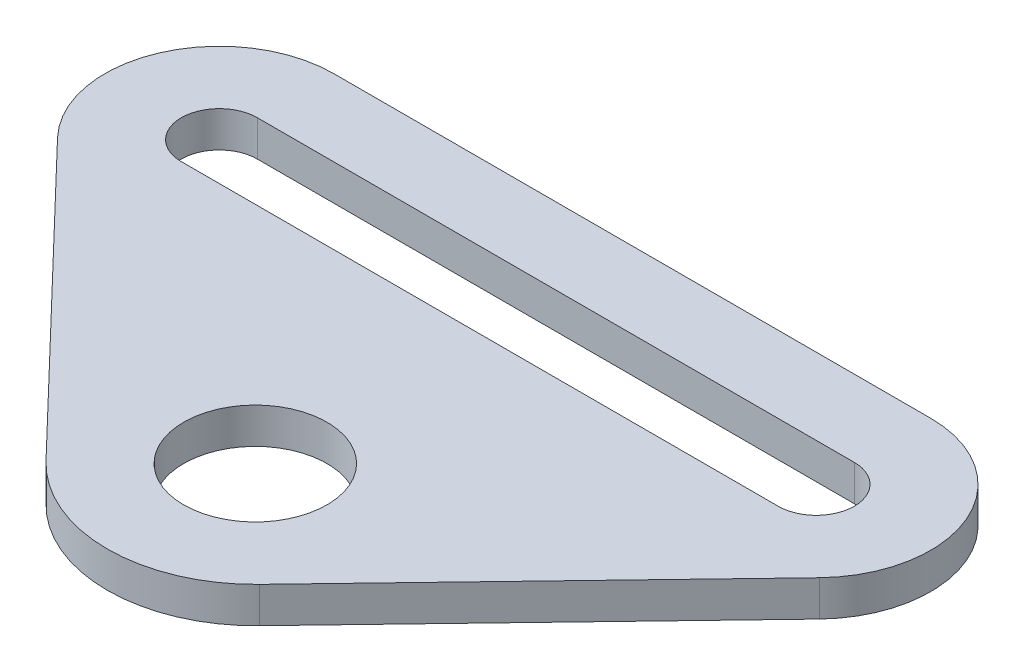
ISO-10303-21;
HEADER;
FILE_DESCRIPTION(('STEP AP214'),'2;1');
FILE_NAME('part.step','',(''),(''),'','','');
FILE_SCHEMA(('AUTOMOTIVE_DESIGN { 1 0 10303 214 1 1 1 1 }'));
ENDSEC;
DATA;
#1=APPLICATION_CONTEXT('core data for automotive mechanical design processes');
#2=APPLICATION_PROTOCOL_DEFINITION('international standard','automotive_design',2000,#1);
#3=PRODUCT_CONTEXT('',#1,'mechanical');
#4=PRODUCT('Part','Part','',(#3));
#5=PRODUCT_RELATED_PRODUCT_CATEGORY('part','',(#4));
#6=PRODUCT_DEFINITION_FORMATION('','',#4);
#7=PRODUCT_DEFINITION_CONTEXT('part definition',#1,'design');
#8=PRODUCT_DEFINITION('design','',#6,#7);
#9=PRODUCT_DEFINITION_SHAPE('','',#8);
#10=(LENGTH_UNIT() NAMED_UNIT(*) SI_UNIT(.MILLI.,.METRE.));
#11=(NAMED_UNIT(*) PLANE_ANGLE_UNIT() SI_UNIT($,.RADIAN.));
#12=(NAMED_UNIT(*) SI_UNIT($,.STERADIAN.) SOLID_ANGLE_UNIT());
#13=UNCERTAINTY_MEASURE_WITH_UNIT(LENGTH_MEASURE(1.E-05),#10,'distance_accuracy_value','');
#14=(GEOMETRIC_REPRESENTATION_CONTEXT(3) GLOBAL_UNCERTAINTY_ASSIGNED_CONTEXT((#13)) GLOBAL_UNIT_ASSIGNED_CONTEXT((#10,
#11,#12)) REPRESENTATION_CONTEXT('',''));
#15=CARTESIAN_POINT('',(0.,0.,0.));
#16=DIRECTION('',(0.,0.,1.));
#17=DIRECTION('',(1.,0.,0.));
#18=AXIS2_PLACEMENT_3D('',#15,#16,#17);
#19=CARTESIAN_POINT('',(25.,3.,-21.9844553636769));
#20=DIRECTION('',(0.,1.,0.));
#21=DIRECTION('',(0.,0.,1.));
#22=AXIS2_PLACEMENT_3D('',#19,#20,#21);
#23=PLANE('',#22);
#24=DIRECTION('',(1.,0.,0.));
#25=VECTOR('',#24,1.);
#26=CARTESIAN_POINT('',(-25.,3.,-18.8));
#27=LINE('',#26,#25);
#28=CARTESIAN_POINT('',(-25.,3.,-18.8));
#29=VERTEX_POINT('',#28);
#30=CARTESIAN_POINT('',(25.,3.,-18.8));
#31=VERTEX_POINT('',#30);
#32=EDGE_CURVE('E132',#29,#31,#27,.T.);
#33=ORIENTED_EDGE('',*,*,#32,.F.);
#34=CARTESIAN_POINT('',(-25.,3.,-21.9844553636769));
#35=DIRECTION('',(0.,1.,0.));
#36=DIRECTION('',(0.,0.,1.));
#37=AXIS2_PLACEMENT_3D('',#34,#35,#36);
#38=CIRCLE('',#37,3.1844553636769);
#39=CARTESIAN_POINT('',(-25.,3.,-25.1689107273538));
#40=VERTEX_POINT('',#39);
#41=EDGE_CURVE('E123',#40,#29,#38,.T.);
#42=ORIENTED_EDGE('',*,*,#41,.F.);
#43=DIRECTION('',(-1.,0.,0.));
#44=VECTOR('',#43,1.);
#45=CARTESIAN_POINT('',(-25.,3.,-25.1689107273538));
#46=LINE('',#45,#44);
#47=CARTESIAN_POINT('',(25.,3.,-25.1689107273538));
#48=VERTEX_POINT('',#47);
#49=EDGE_CURVE('E150',#48,#40,#46,.T.);
#50=ORIENTED_EDGE('',*,*,#49,.F.);
#51=CARTESIAN_POINT('',(25.,3.,-21.9844553636769));
#52=DIRECTION('',(0.,1.,0.));
#53=DIRECTION('',(0.,0.,1.));
#54=AXIS2_PLACEMENT_3D('',#51,#52,#53);
#55=CIRCLE('',#54,3.1844553636769);
#56=EDGE_CURVE('E146',#31,#48,#55,.T.);
#57=ORIENTED_EDGE('',*,*,#56,.F.);
#58=EDGE_LOOP('',(#33,#42,#50,#57));
#59=FACE_BOUND('',#58,.T.);
#60=CARTESIAN_POINT('',(25.,3.,-21.9844553636769));
#61=DIRECTION('',(0.,1.,0.));
#62=DIRECTION('',(0.,0.,1.));
#63=AXIS2_PLACEMENT_3D('',#60,#61,#62);
#64=CIRCLE('',#63,9.58445536367691);
#65=CARTESIAN_POINT('',(31.9152643441121,3.,-15.3481232691109));
#66=VERTEX_POINT('',#65);
#67=CARTESIAN_POINT('',(25.,3.,-31.5689107273538));
#68=VERTEX_POINT('',#67);
#69=EDGE_CURVE('E174',#66,#68,#64,.T.);
#70=ORIENTED_EDGE('',*,*,#69,.T.);
#71=DIRECTION('',(-1.,0.,0.));
#72=VECTOR('',#71,1.);
#73=CARTESIAN_POINT('',(25.,3.,-31.5689107273538));
#74=LINE('',#73,#72);
#75=CARTESIAN_POINT('',(-25.,3.,-31.5689107273538));
#76=VERTEX_POINT('',#75);
#77=EDGE_CURVE('E178',#68,#76,#74,.T.);
#78=ORIENTED_EDGE('',*,*,#77,.T.);
#79=CARTESIAN_POINT('',(-25.,3.,-21.9844553636769));
#80=DIRECTION('',(0.,1.,0.));
#81=DIRECTION('',(0.,0.,1.));
#82=AXIS2_PLACEMENT_3D('',#79,#80,#81);
#83=CIRCLE('',#82,9.58445536367691);
#84=CARTESIAN_POINT('',(-31.9152643441121,3.,-15.3481232691109));
#85=VERTEX_POINT('',#84);
#86=EDGE_CURVE('E182',#76,#85,#83,.T.);
#87=ORIENTED_EDGE('',*,*,#86,.T.);
#88=DIRECTION('',(0.692405759404582,0.,0.721508325900238));
#89=VECTOR('',#88,1.);
#90=CARTESIAN_POINT('',(-8.94670324116295,3.,8.58583141661682));
#91=LINE('',#90,#89);
#92=CARTESIAN_POINT('',(-8.94670324116295,3.,8.58583141661682));
#93=VERTEX_POINT('',#92);
#94=EDGE_CURVE('E185',#85,#93,#91,.T.);
#95=ORIENTED_EDGE('',*,*,#94,.T.);
#96=CARTESIAN_POINT('',(0.,3.,0.));
#97=DIRECTION('',(0.,1.,0.));
#98=DIRECTION('',(0.,0.,1.));
#99=AXIS2_PLACEMENT_3D('',#96,#97,#98);
#100=CIRCLE('',#99,12.4);
#101=CARTESIAN_POINT('',(8.94670324116294,3.,8.58583141661682));
#102=VERTEX_POINT('',#101);
#103=EDGE_CURVE('E188',#93,#102,#100,.T.);
#104=ORIENTED_EDGE('',*,*,#103,.T.);
#105=DIRECTION('',(0.692405759404582,0.,-0.721508325900238));
#106=VECTOR('',#105,1.);
#107=CARTESIAN_POINT('',(8.94670324116295,3.,8.58583141661682));
#108=LINE('',#107,#106);
#109=EDGE_CURVE('E191',#102,#66,#108,.T.);
#110=ORIENTED_EDGE('',*,*,#109,.T.);
#111=EDGE_LOOP('',(#70,#78,#87,#95,#104,#110));
#112=FACE_BOUND('',#111,.T.);
#113=CARTESIAN_POINT('',(0.,3.,0.));
#114=DIRECTION('',(0.,1.,0.));
#115=DIRECTION('',(0.,0.,1.));
#116=AXIS2_PLACEMENT_3D('',#113,#114,#115);
#117=CIRCLE('',#116,6.);
#118=CARTESIAN_POINT('',(0.,3.,6.));
#119=VERTEX_POINT('',#118);
#120=EDGE_CURVE('E158',#119,#119,#117,.T.);
#121=ORIENTED_EDGE('',*,*,#120,.F.);
#122=EDGE_LOOP('',(#121));
#123=FACE_BOUND('',#122,.T.);
#124=ADVANCED_FACE('F45',(#59,#112,#123),#23,.T.);
#125=CARTESIAN_POINT('',(25.,0.,-21.9844553636769));
#126=DIRECTION('',(0.,1.,0.));
#127=DIRECTION('',(0.,0.,1.));
#128=AXIS2_PLACEMENT_3D('',#125,#126,#127);
#129=PLANE('',#128);
#130=CARTESIAN_POINT('',(25.,0.,-21.9844553636769));
#131=DIRECTION('',(0.,1.,0.));
#132=DIRECTION('',(0.,0.,1.));
#133=AXIS2_PLACEMENT_3D('',#130,#131,#132);
#134=CIRCLE('',#133,9.58445536367691);
#135=CARTESIAN_POINT('',(31.9152643441121,0.,-15.3481232691109));
#136=VERTEX_POINT('',#135);
#137=CARTESIAN_POINT('',(25.,0.,-31.5689107273538));
#138=VERTEX_POINT('',#137);
#139=EDGE_CURVE('E141',#136,#138,#134,.T.);
#140=ORIENTED_EDGE('',*,*,#139,.F.);
#141=DIRECTION('',(0.692405759404582,0.,-0.721508325900238));
#142=VECTOR('',#141,1.);
#143=CARTESIAN_POINT('',(8.94670324116295,0.,8.58583141661682));
#144=LINE('',#143,#142);
#145=CARTESIAN_POINT('',(8.94670324116294,0.,8.58583141661682));
#146=VERTEX_POINT('',#145);
#147=EDGE_CURVE('E179',#146,#136,#144,.T.);
#148=ORIENTED_EDGE('',*,*,#147,.F.);
#149=CARTESIAN_POINT('',(0.,0.,0.));
#150=DIRECTION('',(0.,1.,0.));
#151=DIRECTION('',(0.,0.,1.));
#152=AXIS2_PLACEMENT_3D('',#149,#150,#151);
#153=CIRCLE('',#152,12.4);
#154=CARTESIAN_POINT('',(-8.94670324116295,0.,8.58583141661682));
#155=VERTEX_POINT('',#154);
#156=EDGE_CURVE('E207',#155,#146,#153,.T.);
#157=ORIENTED_EDGE('',*,*,#156,.F.);
#158=DIRECTION('',(0.692405759404582,0.,0.721508325900238));
#159=VECTOR('',#158,1.);
#160=CARTESIAN_POINT('',(-8.94670324116295,0.,8.58583141661682));
#161=LINE('',#160,#159);
#162=CARTESIAN_POINT('',(-31.9152643441121,0.,-15.3481232691109));
#163=VERTEX_POINT('',#162);
#164=EDGE_CURVE('E204',#163,#155,#161,.T.);
#165=ORIENTED_EDGE('',*,*,#164,.F.);
#166=CARTESIAN_POINT('',(-25.,0.,-21.9844553636769));
#167=DIRECTION('',(0.,1.,0.));
#168=DIRECTION('',(0.,0.,1.));
#169=AXIS2_PLACEMENT_3D('',#166,#167,#168);
#170=CIRCLE('',#169,9.58445536367691);
#171=CARTESIAN_POINT('',(-25.,0.,-31.5689107273538));
#172=VERTEX_POINT('',#171);
#173=EDGE_CURVE('E201',#172,#163,#170,.T.);
#174=ORIENTED_EDGE('',*,*,#173,.F.);
#175=DIRECTION('',(-1.,0.,0.));
#176=VECTOR('',#175,1.);
#177=CARTESIAN_POINT('',(25.,0.,-31.5689107273538));
#178=LINE('',#177,#176);
#179=EDGE_CURVE('E198',#138,#172,#178,.T.);
#180=ORIENTED_EDGE('',*,*,#179,.F.);
#181=EDGE_LOOP('',(#140,#148,#157,#165,#174,#180));
#182=FACE_BOUND('',#181,.T.);
#183=CARTESIAN_POINT('',(-25.,0.,-21.9844553636769));
#184=DIRECTION('',(0.,1.,0.));
#185=DIRECTION('',(0.,0.,1.));
#186=AXIS2_PLACEMENT_3D('',#183,#184,#185);
#187=CIRCLE('',#186,3.1844553636769);
#188=CARTESIAN_POINT('',(-25.,0.,-25.1689107273538));
#189=VERTEX_POINT('',#188);
#190=CARTESIAN_POINT('',(-25.,0.,-18.8));
#191=VERTEX_POINT('',#190);
#192=EDGE_CURVE('E69',#189,#191,#187,.T.);
#193=ORIENTED_EDGE('',*,*,#192,.T.);
#194=DIRECTION('',(1.,0.,0.));
#195=VECTOR('',#194,1.);
#196=CARTESIAN_POINT('',(-25.,0.,-18.8));
#197=LINE('',#196,#195);
#198=CARTESIAN_POINT('',(25.,0.,-18.8));
#199=VERTEX_POINT('',#198);
#200=EDGE_CURVE('E139',#191,#199,#197,.T.);
#201=ORIENTED_EDGE('',*,*,#200,.T.);
#202=CARTESIAN_POINT('',(25.,0.,-21.9844553636769));
#203=DIRECTION('',(0.,1.,0.));
#204=DIRECTION('',(0.,0.,1.));
#205=AXIS2_PLACEMENT_3D('',#202,#203,#204);
#206=CIRCLE('',#205,3.1844553636769);
#207=CARTESIAN_POINT('',(25.,0.,-25.1689107273538));
#208=VERTEX_POINT('',#207);
#209=EDGE_CURVE('E161',#199,#208,#206,.T.);
#210=ORIENTED_EDGE('',*,*,#209,.T.);
#211=DIRECTION('',(-1.,0.,0.));
#212=VECTOR('',#211,1.);
#213=CARTESIAN_POINT('',(-25.,0.,-25.1689107273538));
#214=LINE('',#213,#212);
#215=EDGE_CURVE('E133',#208,#189,#214,.T.);
#216=ORIENTED_EDGE('',*,*,#215,.T.);
#217=EDGE_LOOP('',(#193,#201,#210,#216));
#218=FACE_BOUND('',#217,.T.);
#219=CARTESIAN_POINT('',(0.,0.,0.));
#220=DIRECTION('',(0.,1.,0.));
#221=DIRECTION('',(0.,0.,1.));
#222=AXIS2_PLACEMENT_3D('',#219,#220,#221);
#223=CIRCLE('',#222,6.);
#224=CARTESIAN_POINT('',(0.,0.,6.));
#225=VERTEX_POINT('',#224);
#226=EDGE_CURVE('E293',#225,#225,#223,.T.);
#227=ORIENTED_EDGE('',*,*,#226,.T.);
#228=EDGE_LOOP('',(#227));
#229=FACE_BOUND('',#228,.T.);
#230=ADVANCED_FACE('F238',(#182,#218,#229),#129,.F.);
#231=CARTESIAN_POINT('',(25.,3.,-21.9844553636769));
#232=DIRECTION('',(0.,-1.,0.));
#233=DIRECTION('',(0.,0.,-1.));
#234=AXIS2_PLACEMENT_3D('',#231,#232,#233);
#235=CYLINDRICAL_SURFACE('',#234,9.58445536367691);
#236=ORIENTED_EDGE('',*,*,#139,.T.);
#237=DIRECTION('',(0.,-1.,0.));
#238=VECTOR('',#237,1.);
#239=CARTESIAN_POINT('',(25.,3.,-31.5689107273538));
#240=LINE('',#239,#238);
#241=EDGE_CURVE('E11',#68,#138,#240,.T.);
#242=ORIENTED_EDGE('',*,*,#241,.F.);
#243=ORIENTED_EDGE('',*,*,#69,.F.);
#244=DIRECTION('',(0.,-1.,0.));
#245=VECTOR('',#244,1.);
#246=CARTESIAN_POINT('',(31.9152643441121,3.,-15.3481232691109));
#247=LINE('',#246,#245);
#248=EDGE_CURVE('E194',#66,#136,#247,.T.);
#249=ORIENTED_EDGE('',*,*,#248,.T.);
#250=EDGE_LOOP('',(#236,#242,#243,#249));
#251=FACE_BOUND('',#250,.T.);
#252=ADVANCED_FACE('F47',(#251),#235,.T.);
#253=CARTESIAN_POINT('',(25.,3.,-31.5689107273538));
#254=DIRECTION('',(0.,0.,1.));
#255=DIRECTION('',(1.,0.,0.));
#256=AXIS2_PLACEMENT_3D('',#253,#254,#255);
#257=PLANE('',#256);
#258=ORIENTED_EDGE('',*,*,#179,.T.);
#259=DIRECTION('',(0.,-1.,0.));
#260=VECTOR('',#259,1.);
#261=CARTESIAN_POINT('',(-25.,3.,-31.5689107273538));
#262=LINE('',#261,#260);
#263=EDGE_CURVE('E54',#76,#172,#262,.T.);
#264=ORIENTED_EDGE('',*,*,#263,.F.);
#265=ORIENTED_EDGE('',*,*,#77,.F.);
#266=ORIENTED_EDGE('',*,*,#241,.T.);
#267=EDGE_LOOP('',(#258,#264,#265,#266));
#268=FACE_BOUND('',#267,.T.);
#269=ADVANCED_FACE('F255',(#268),#257,.F.);
#270=CARTESIAN_POINT('',(-25.,3.,-21.9844553636769));
#271=DIRECTION('',(0.,-1.,0.));
#272=DIRECTION('',(0.,0.,-1.));
#273=AXIS2_PLACEMENT_3D('',#270,#271,#272);
#274=CYLINDRICAL_SURFACE('',#273,9.58445536367691);
#275=ORIENTED_EDGE('',*,*,#173,.T.);
#276=DIRECTION('',(0.,-1.,0.));
#277=VECTOR('',#276,1.);
#278=CARTESIAN_POINT('',(-31.9152643441121,3.,-15.3481232691109));
#279=LINE('',#278,#277);
#280=EDGE_CURVE('E223',#85,#163,#279,.T.);
#281=ORIENTED_EDGE('',*,*,#280,.F.);
#282=ORIENTED_EDGE('',*,*,#86,.F.);
#283=ORIENTED_EDGE('',*,*,#263,.T.);
#284=EDGE_LOOP('',(#275,#281,#282,#283));
#285=FACE_BOUND('',#284,.T.);
#286=ADVANCED_FACE('F232',(#285),#274,.T.);
#287=CARTESIAN_POINT('',(-8.94670324116295,3.,8.58583141661682));
#288=DIRECTION('',(0.721508325900238,0.,-0.692405759404582));
#289=DIRECTION('',(-0.692405759404582,0.,-0.721508325900238));
#290=AXIS2_PLACEMENT_3D('',#287,#288,#289);
#291=PLANE('',#290);
#292=ORIENTED_EDGE('',*,*,#164,.T.);
#293=DIRECTION('',(0.,-1.,0.));
#294=VECTOR('',#293,1.);
#295=CARTESIAN_POINT('',(-8.94670324116295,3.,8.58583141661682));
#296=LINE('',#295,#294);
#297=EDGE_CURVE('E219',#93,#155,#296,.T.);
#298=ORIENTED_EDGE('',*,*,#297,.F.);
#299=ORIENTED_EDGE('',*,*,#94,.F.);
#300=ORIENTED_EDGE('',*,*,#280,.T.);
#301=EDGE_LOOP('',(#292,#298,#299,#300));
#302=FACE_BOUND('',#301,.T.);
#303=ADVANCED_FACE('F244',(#302),#291,.F.);
#304=CARTESIAN_POINT('',(0.,3.,0.));
#305=DIRECTION('',(0.,-1.,0.));
#306=DIRECTION('',(0.,0.,-1.));
#307=AXIS2_PLACEMENT_3D('',#304,#305,#306);
#308=CYLINDRICAL_SURFACE('',#307,12.4);
#309=ORIENTED_EDGE('',*,*,#156,.T.);
#310=DIRECTION('',(0.,-1.,0.));
#311=VECTOR('',#310,1.);
#312=CARTESIAN_POINT('',(8.94670324116294,3.,8.58583141661682));
#313=LINE('',#312,#311);
#314=EDGE_CURVE('E215',#102,#146,#313,.T.);
#315=ORIENTED_EDGE('',*,*,#314,.F.);
#316=ORIENTED_EDGE('',*,*,#103,.F.);
#317=ORIENTED_EDGE('',*,*,#297,.T.);
#318=EDGE_LOOP('',(#309,#315,#316,#317));
#319=FACE_BOUND('',#318,.T.);
#320=ADVANCED_FACE('F248',(#319),#308,.T.);
#321=CARTESIAN_POINT('',(8.94670324116295,3.,8.58583141661682));
#322=DIRECTION('',(-0.721508325900238,0.,-0.692405759404582));
#323=DIRECTION('',(-0.692405759404582,0.,0.721508325900238));
#324=AXIS2_PLACEMENT_3D('',#321,#322,#323);
#325=PLANE('',#324);
#326=ORIENTED_EDGE('',*,*,#147,.T.);
#327=ORIENTED_EDGE('',*,*,#248,.F.);
#328=ORIENTED_EDGE('',*,*,#109,.F.);
#329=ORIENTED_EDGE('',*,*,#314,.T.);
#330=EDGE_LOOP('',(#326,#327,#328,#329));
#331=FACE_BOUND('',#330,.T.);
#332=ADVANCED_FACE('F258',(#331),#325,.F.);
#333=CARTESIAN_POINT('',(-25.,3.,-21.9844553636769));
#334=DIRECTION('',(0.,-1.,0.));
#335=DIRECTION('',(0.,0.,-1.));
#336=AXIS2_PLACEMENT_3D('',#333,#334,#335);
#337=CYLINDRICAL_SURFACE('',#336,3.1844553636769);
#338=ORIENTED_EDGE('',*,*,#192,.F.);
#339=DIRECTION('',(0.,-1.,0.));
#340=VECTOR('',#339,1.);
#341=CARTESIAN_POINT('',(-25.,3.,-25.1689107273538));
#342=LINE('',#341,#340);
#343=EDGE_CURVE('E127',#40,#189,#342,.T.);
#344=ORIENTED_EDGE('',*,*,#343,.F.);
#345=ORIENTED_EDGE('',*,*,#41,.T.);
#346=DIRECTION('',(0.,-1.,0.));
#347=VECTOR('',#346,1.);
#348=CARTESIAN_POINT('',(-25.,3.,-18.8));
#349=LINE('',#348,#347);
#350=EDGE_CURVE('E126',#29,#191,#349,.T.);
#351=ORIENTED_EDGE('',*,*,#350,.T.);
#352=EDGE_LOOP('',(#338,#344,#345,#351));
#353=FACE_BOUND('',#352,.T.);
#354=ADVANCED_FACE('F125',(#353),#337,.F.);
#355=CARTESIAN_POINT('',(-25.,3.,-18.8));
#356=DIRECTION('',(0.,0.,-1.));
#357=DIRECTION('',(-1.,0.,0.));
#358=AXIS2_PLACEMENT_3D('',#355,#356,#357);
#359=PLANE('',#358);
#360=ORIENTED_EDGE('',*,*,#200,.F.);
#361=ORIENTED_EDGE('',*,*,#350,.F.);
#362=ORIENTED_EDGE('',*,*,#32,.T.);
#363=DIRECTION('',(0.,-1.,0.));
#364=VECTOR('',#363,1.);
#365=CARTESIAN_POINT('',(25.,3.,-18.8));
#366=LINE('',#365,#364);
#367=EDGE_CURVE('E142',#31,#199,#366,.T.);
#368=ORIENTED_EDGE('',*,*,#367,.T.);
#369=EDGE_LOOP('',(#360,#361,#362,#368));
#370=FACE_BOUND('',#369,.T.);
#371=ADVANCED_FACE('F136',(#370),#359,.T.);
#372=CARTESIAN_POINT('',(25.,3.,-21.9844553636769));
#373=DIRECTION('',(0.,-1.,0.));
#374=DIRECTION('',(0.,0.,-1.));
#375=AXIS2_PLACEMENT_3D('',#372,#373,#374);
#376=CYLINDRICAL_SURFACE('',#375,3.1844553636769);
#377=ORIENTED_EDGE('',*,*,#209,.F.);
#378=ORIENTED_EDGE('',*,*,#367,.F.);
#379=ORIENTED_EDGE('',*,*,#56,.T.);
#380=DIRECTION('',(0.,-1.,0.));
#381=VECTOR('',#380,1.);
#382=CARTESIAN_POINT('',(25.,3.,-25.1689107273538));
#383=LINE('',#382,#381);
#384=EDGE_CURVE('E61',#48,#208,#383,.T.);
#385=ORIENTED_EDGE('',*,*,#384,.T.);
#386=EDGE_LOOP('',(#377,#378,#379,#385));
#387=FACE_BOUND('',#386,.T.);
#388=ADVANCED_FACE('F276',(#387),#376,.F.);
#389=CARTESIAN_POINT('',(-25.,3.,-25.1689107273538));
#390=DIRECTION('',(0.,0.,1.));
#391=DIRECTION('',(1.,0.,0.));
#392=AXIS2_PLACEMENT_3D('',#389,#390,#391);
#393=PLANE('',#392);
#394=ORIENTED_EDGE('',*,*,#215,.F.);
#395=ORIENTED_EDGE('',*,*,#384,.F.);
#396=ORIENTED_EDGE('',*,*,#49,.T.);
#397=ORIENTED_EDGE('',*,*,#343,.T.);
#398=EDGE_LOOP('',(#394,#395,#396,#397));
#399=FACE_BOUND('',#398,.T.);
#400=ADVANCED_FACE('F279',(#399),#393,.T.);
#401=CARTESIAN_POINT('',(0.,3.,0.));
#402=DIRECTION('',(0.,-1.,0.));
#403=DIRECTION('',(0.,0.,-1.));
#404=AXIS2_PLACEMENT_3D('',#401,#402,#403);
#405=CYLINDRICAL_SURFACE('',#404,6.);
#406=ORIENTED_EDGE('',*,*,#120,.T.);
#407=EDGE_LOOP('',(#406));
#408=FACE_BOUND('',#407,.T.);
#409=ORIENTED_EDGE('',*,*,#226,.F.);
#410=EDGE_LOOP('',(#409));
#411=FACE_BOUND('',#410,.T.);
#412=ADVANCED_FACE('F283',(#408,#411),#405,.F.);
#413=CLOSED_SHELL('',(#124,#230,#252,#269,#286,#303,#320,#332,#354,#371,#388,#400,#412));
#414=MANIFOLD_SOLID_BREP('B2',#413);
#415=ADVANCED_BREP_SHAPE_REPRESENTATION('',(#18,#414),#14);
#416=SHAPE_DEFINITION_REPRESENTATION(#9,#415);
ENDSEC;
END-ISO-10303-21;
